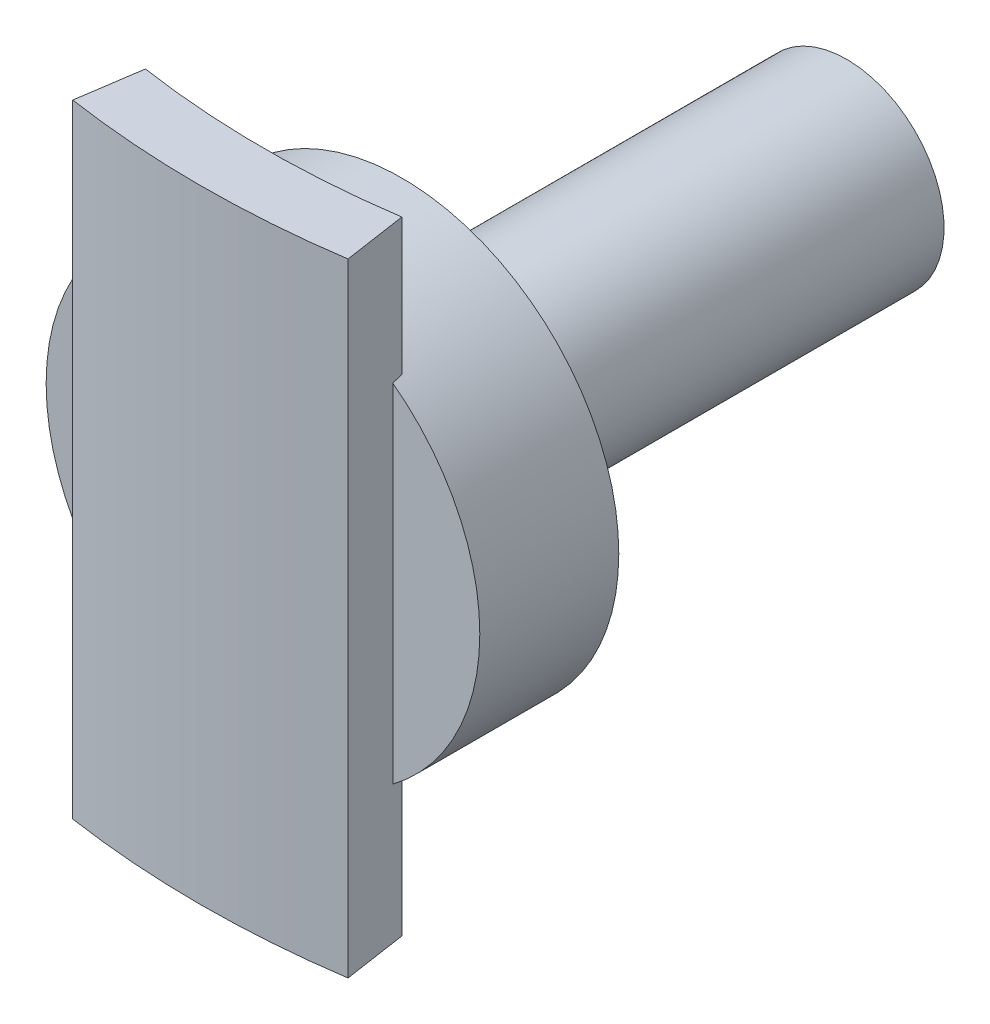
ISO-10303-21;
HEADER;
FILE_DESCRIPTION(('STEP AP214'),'2;1');
FILE_NAME('part.step','',(''),(''),'','','');
FILE_SCHEMA(('AUTOMOTIVE_DESIGN { 1 0 10303 214 1 1 1 1 }'));
ENDSEC;
DATA;
#1=APPLICATION_CONTEXT('core data for automotive mechanical design processes');
#2=APPLICATION_PROTOCOL_DEFINITION('international standard','automotive_design',2000,#1);
#3=PRODUCT_CONTEXT('',#1,'mechanical');
#4=PRODUCT('Part','Part','',(#3));
#5=PRODUCT_RELATED_PRODUCT_CATEGORY('part','',(#4));
#6=PRODUCT_DEFINITION_FORMATION('','',#4);
#7=PRODUCT_DEFINITION_CONTEXT('part definition',#1,'design');
#8=PRODUCT_DEFINITION('design','',#6,#7);
#9=PRODUCT_DEFINITION_SHAPE('','',#8);
#10=(LENGTH_UNIT() NAMED_UNIT(*) SI_UNIT(.MILLI.,.METRE.));
#11=(NAMED_UNIT(*) PLANE_ANGLE_UNIT() SI_UNIT($,.RADIAN.));
#12=(NAMED_UNIT(*) SI_UNIT($,.STERADIAN.) SOLID_ANGLE_UNIT());
#13=UNCERTAINTY_MEASURE_WITH_UNIT(LENGTH_MEASURE(1.E-05),#10,'distance_accuracy_value','');
#14=(GEOMETRIC_REPRESENTATION_CONTEXT(3) GLOBAL_UNCERTAINTY_ASSIGNED_CONTEXT((#13)) GLOBAL_UNIT_ASSIGNED_CONTEXT((#10,
#11,#12)) REPRESENTATION_CONTEXT('',''));
#15=CARTESIAN_POINT('',(0.,0.,0.));
#16=DIRECTION('',(0.,0.,1.));
#17=DIRECTION('',(1.,0.,0.));
#18=AXIS2_PLACEMENT_3D('',#15,#16,#17);
#19=CARTESIAN_POINT('',(0.,20.2,0.));
#20=DIRECTION('',(0.,-1.,0.));
#21=DIRECTION('',(0.,0.,-1.));
#22=AXIS2_PLACEMENT_3D('',#19,#20,#21);
#23=CYLINDRICAL_SURFACE('',#22,15.6);
#24=DIRECTION('',(0.,1.,0.));
#25=VECTOR('',#24,1.);
#26=CARTESIAN_POINT('',(-2.30582681362193,0.,15.4286474684459));
#27=LINE('',#26,#25);
#28=CARTESIAN_POINT('',(-2.30582681362193,22.1,15.4286474684459));
#29=VERTEX_POINT('',#28);
#30=CARTESIAN_POINT('',(-2.30582681362193,24.5546601605578,15.4286474684459));
#31=VERTEX_POINT('',#30);
#32=EDGE_CURVE('E153',#29,#31,#27,.T.);
#33=ORIENTED_EDGE('',*,*,#32,.T.);
#34=CARTESIAN_POINT('',(-3.9,27.7,15.1046350502089));
#35=CARTESIAN_POINT('',(-3.89999388260519,27.4846408285545,15.1046391613706));
#36=CARTESIAN_POINT('',(-3.88210094297634,27.2692139580615,15.1092911738277));
#37=CARTESIAN_POINT('',(-3.81111607572352,26.8445465780493,15.127349047084));
#38=CARTESIAN_POINT('',(-3.75800366251768,26.6353097430296,15.1407600024974));
#39=CARTESIAN_POINT('',(-3.61840627142598,26.229226480428,15.1747241036999));
#40=CARTESIAN_POINT('',(-3.53196437545301,26.0323644375983,15.1952680259711));
#41=CARTESIAN_POINT('',(-3.32829298036776,25.6559150700378,15.2411717956486));
#42=CARTESIAN_POINT('',(-3.21106217415467,25.4763284791549,15.2665318475044));
#43=CARTESIAN_POINT('',(-2.94638514660653,25.1355758333909,15.3198351751477));
#44=CARTESIAN_POINT('',(-2.79838554481832,24.9748459834539,15.3478197229193));
#45=CARTESIAN_POINT('',(-2.47756401999703,24.6802122247979,15.4028608580386));
#46=CARTESIAN_POINT('',(-2.30473977892128,24.5463108240301,15.4299173584357));
#47=CARTESIAN_POINT('',(-1.93618651368317,24.3073502704952,15.4805104821211));
#48=CARTESIAN_POINT('',(-1.74017153886439,24.2027196344681,15.5039927234492));
#49=CARTESIAN_POINT('',(-1.33265056749671,24.0280569551212,15.5443206660453));
#50=CARTESIAN_POINT('',(-1.12114686183543,23.9580198070118,15.5611673464158));
#51=CARTESIAN_POINT('',(-0.693199663656491,23.8559293780574,15.5860342380316));
#52=CARTESIAN_POINT('',(-0.476943042496402,23.8231353548505,15.5942263439713));
#53=CARTESIAN_POINT('',(-0.0418529580499183,23.7941369283301,15.6014600680739));
#54=CARTESIAN_POINT('',(0.176980119479392,23.797927115353,15.6005030391087));
#55=CARTESIAN_POINT('',(0.605873763972307,23.8414567663902,15.589674281275));
#56=CARTESIAN_POINT('',(0.816021240844146,23.880396667084,15.5800008365172));
#57=CARTESIAN_POINT('',(1.22669916491339,23.9918351812757,15.5530570497882));
#58=CARTESIAN_POINT('',(1.42722909954476,24.0643355811889,15.5357863034174));
#59=CARTESIAN_POINT('',(1.81508614365699,24.2414840102717,15.4952851513322));
#60=CARTESIAN_POINT('',(2.00227758808916,24.3464165896719,15.4720023072363));
#61=CARTESIAN_POINT('',(2.35667492712812,24.5852348594218,15.422002499437));
#62=CARTESIAN_POINT('',(2.52387733683426,24.7191255869562,15.3952849386031));
#63=CARTESIAN_POINT('',(2.83831873683052,25.0163456374908,15.3404739347796));
#64=CARTESIAN_POINT('',(2.98489494839022,25.1803736320562,15.3123628245103));
#65=CARTESIAN_POINT('',(3.24860786625883,25.5309759587292,15.2585946789546));
#66=CARTESIAN_POINT('',(3.36574319659088,25.7175513440298,15.2329377584043));
#67=CARTESIAN_POINT('',(3.56767370317946,26.1092524532539,15.1869197502202));
#68=CARTESIAN_POINT('',(3.65230931114669,26.3144637392104,15.1665849448002));
#69=CARTESIAN_POINT('',(3.78567392044301,26.7368333301191,15.1338507851364));
#70=CARTESIAN_POINT('',(3.83441060554653,26.9539890677913,15.1214497328337));
#71=CARTESIAN_POINT('',(3.89349423632805,27.3879368224039,15.1063435540213));
#72=CARTESIAN_POINT('',(3.9048211393163,27.6045869576166,15.1033909881218));
#73=CARTESIAN_POINT('',(3.89144650520118,28.0366822210684,15.1068425564075));
#74=CARTESIAN_POINT('',(3.86674828464504,28.2521274583999,15.113245829275));
#75=CARTESIAN_POINT('',(3.78288372374432,28.672058253321,15.134450478987));
#76=CARTESIAN_POINT('',(3.72428794651994,28.8766654534483,15.1491127357892));
#77=CARTESIAN_POINT('',(3.57492420740575,29.2731530742509,15.185051204894));
#78=CARTESIAN_POINT('',(3.48415243443146,29.4650319841269,15.2063282006424));
#79=CARTESIAN_POINT('',(3.27096224198114,29.8347683934725,15.2536197386916));
#80=CARTESIAN_POINT('',(3.14795793598361,30.0122769904671,15.2797190302734));
#81=CARTESIAN_POINT('',(2.87453514244435,30.3444938459703,15.3335064959089));
#82=CARTESIAN_POINT('',(2.72411214974121,30.4991983499742,15.3611949305615));
#83=CARTESIAN_POINT('',(2.39562461184044,30.7853852264107,15.4158794872958));
#84=CARTESIAN_POINT('',(2.21696261487321,30.9161896975761,15.4428409521654));
#85=CARTESIAN_POINT('',(1.83964046250923,31.1459399524439,15.4923165791735));
#86=CARTESIAN_POINT('',(1.64098135093461,31.2448873979088,15.5148309732616));
#87=CARTESIAN_POINT('',(1.23067698675125,31.4072558138636,15.5527338055179));
#88=CARTESIAN_POINT('',(1.01913778600874,31.4709322836313,15.5681733483496));
#89=CARTESIAN_POINT('',(0.587924065243346,31.5617181219891,15.5904105769743));
#90=CARTESIAN_POINT('',(0.368251123660837,31.5888345476329,15.5972099305374));
#91=CARTESIAN_POINT('',(-0.0666257531289618,31.6053335993446,15.6013326069434));
#92=CARTESIAN_POINT('',(-0.281789925167486,31.5957166654721,15.5989071763196));
#93=CARTESIAN_POINT('',(-0.707333236017529,31.541313473552,15.5854099618403));
#94=CARTESIAN_POINT('',(-0.917712516945622,31.4965282614486,15.5743384351296));
#95=CARTESIAN_POINT('',(-1.32666703901462,31.3735963428936,15.5448318813017));
#96=CARTESIAN_POINT('',(-1.52529972886537,31.2956305320739,15.5264368155933));
#97=CARTESIAN_POINT('',(-1.90677650686234,31.1087147418237,15.4842202676327));
#98=CARTESIAN_POINT('',(-2.08961860093597,30.9997608565851,15.4603981014115));
#99=CARTESIAN_POINT('',(-2.43906752085088,30.7509105874151,15.4091827375312));
#100=CARTESIAN_POINT('',(-2.60518045436351,30.6103354426751,15.3817176607249));
#101=CARTESIAN_POINT('',(-2.91179857906667,30.3035508772883,15.3266353132304));
#102=CARTESIAN_POINT('',(-3.0522972677987,30.1373349671665,15.2990180057248));
#103=CARTESIAN_POINT('',(-3.30627190324014,29.7802544846611,15.2461715579746));
#104=CARTESIAN_POINT('',(-3.41919481572388,29.5889879188755,15.2209965832583));
#105=CARTESIAN_POINT('',(-3.61111489668333,29.1895835894882,15.1766142642983));
#106=CARTESIAN_POINT('',(-3.69013674803339,28.981458232234,15.1574025810953));
#107=CARTESIAN_POINT('',(-3.80024786142691,28.5947496538429,15.1301244412788));
#108=CARTESIAN_POINT('',(-3.83757336532783,28.4180166588941,15.1206378571365));
#109=CARTESIAN_POINT('',(-3.8874509410299,28.060871410909,15.1078917047222));
#110=CARTESIAN_POINT('',(-3.90000512604983,27.8804594730468,15.1046316052752));
#111=CARTESIAN_POINT('',(-3.9,27.7,15.1046350502089));
#112=B_SPLINE_CURVE_WITH_KNOTS('',3,(#34,#35,#36,#37,#38,#39,#40,#41,#42,#43,#44,#45,#46,#47,
#48,#49,#50,#51,#52,#53,#54,#55,#56,#57,#58,#59,#60,#61,#62,#63,#64,#65,#66,#67,#68,#69,#70,#71,
#72,#73,#74,#75,#76,#77,#78,#79,#80,#81,#82,#83,#84,#85,#86,#87,#88,#89,#90,#91,#92,#93,#94,#95,
#96,#97,#98,#99,#100,#101,#102,#103,#104,#105,#106,#107,#108,#109,#110,#111),.UNSPECIFIED.,.T.,
.F.,(4,2,2,2,2,2,2,2,2,2,2,2,2,2,2,2,2,2,2,2,2,2,2,2,2,2,2,2,2,2,2,2,2,2,2,2,2,2,4),(0.,
0.645414809108371,1.29120535662872,1.93616393437899,2.58114989738546,3.23893368541043,
3.89677893508592,4.56380334380755,5.23072929361464,5.88414451552741,6.53746311918992,
7.17628489794757,7.81514068490666,8.45976883836934,9.10450921331505,9.76669927852182,
10.4289202867169,11.0943523393495,11.7596419220605,12.4073597663612,13.055017984184,
13.6920795182603,14.3292165342908,14.9788523955196,15.6285950947234,16.2945951631757,
16.9605604853417,17.6216363359048,18.2825845630977,18.925661759705,19.5687198311976,
20.2083160744482,20.8479929696306,21.502994706797,22.1581624925387,22.8255530457812,
23.4924568534898,24.0333261041369,24.5741492117231),.UNSPECIFIED.);
#113=CARTESIAN_POINT('',(2.30582681362193,24.5546601605578,15.4286474684459));
#114=VERTEX_POINT('',#113);
#115=EDGE_CURVE('E51',#31,#114,#112,.T.);
#116=ORIENTED_EDGE('',*,*,#115,.T.);
#117=DIRECTION('',(0.,1.,0.));
#118=VECTOR('',#117,1.);
#119=CARTESIAN_POINT('',(2.30582681362193,0.,15.4286474684459));
#120=LINE('',#119,#118);
#121=CARTESIAN_POINT('',(2.30582681362193,22.1,15.4286474684459));
#122=VERTEX_POINT('',#121);
#123=EDGE_CURVE('E141',#122,#114,#120,.T.);
#124=ORIENTED_EDGE('',*,*,#123,.F.);
#125=CARTESIAN_POINT('',(0.,22.1,0.));
#126=DIRECTION('',(0.,-1.,0.));
#127=DIRECTION('',(0.,0.,-1.));
#128=AXIS2_PLACEMENT_3D('',#125,#126,#127);
#129=CIRCLE('',#128,15.6);
#130=EDGE_CURVE('E127',#122,#29,#129,.T.);
#131=ORIENTED_EDGE('',*,*,#130,.T.);
#132=EDGE_LOOP('',(#33,#116,#124,#131));
#133=FACE_BOUND('',#132,.T.);
#134=ADVANCED_FACE('F36',(#133),#23,.F.);
#135=CARTESIAN_POINT('',(0.,20.2,0.));
#136=DIRECTION('',(0.,-1.,0.));
#137=DIRECTION('',(0.,0.,-1.));
#138=AXIS2_PLACEMENT_3D('',#135,#136,#137);
#139=CYLINDRICAL_SURFACE('',#138,16.75);
#140=CARTESIAN_POINT('',(0.,22.1,0.));
#141=DIRECTION('',(0.,-1.,0.));
#142=DIRECTION('',(0.,0.,-1.));
#143=AXIS2_PLACEMENT_3D('',#140,#141,#142);
#144=CIRCLE('',#143,16.75);
#145=CARTESIAN_POINT('',(2.47580763642098,22.1,16.5660157113121));
#146=VERTEX_POINT('',#145);
#147=CARTESIAN_POINT('',(-2.47580763642098,22.1,16.5660157113121));
#148=VERTEX_POINT('',#147);
#149=EDGE_CURVE('E124',#146,#148,#144,.T.);
#150=ORIENTED_EDGE('',*,*,#149,.F.);
#151=DIRECTION('',(0.,-1.,0.));
#152=VECTOR('',#151,1.);
#153=CARTESIAN_POINT('',(2.47580763642098,0.,16.5660157113121));
#154=LINE('',#153,#152);
#155=CARTESIAN_POINT('',(2.47580763642098,33.3,16.5660157113121));
#156=VERTEX_POINT('',#155);
#157=EDGE_CURVE('E148',#156,#146,#154,.T.);
#158=ORIENTED_EDGE('',*,*,#157,.F.);
#159=CARTESIAN_POINT('',(0.,33.3,0.));
#160=DIRECTION('',(0.,-1.,0.));
#161=DIRECTION('',(0.,0.,-1.));
#162=AXIS2_PLACEMENT_3D('',#159,#160,#161);
#163=CIRCLE('',#162,16.75);
#164=CARTESIAN_POINT('',(-2.47580763642098,33.3,16.5660157113121));
#165=VERTEX_POINT('',#164);
#166=EDGE_CURVE('E59',#156,#165,#163,.T.);
#167=ORIENTED_EDGE('',*,*,#166,.T.);
#168=DIRECTION('',(0.,-1.,0.));
#169=VECTOR('',#168,1.);
#170=CARTESIAN_POINT('',(-2.47580763642098,0.,16.5660157113121));
#171=LINE('',#170,#169);
#172=EDGE_CURVE('E157',#165,#148,#171,.T.);
#173=ORIENTED_EDGE('',*,*,#172,.T.);
#174=EDGE_LOOP('',(#150,#158,#167,#173));
#175=FACE_BOUND('',#174,.T.);
#176=ADVANCED_FACE('F191',(#175),#139,.T.);
#177=CARTESIAN_POINT('',(0.,22.1,0.));
#178=DIRECTION('',(0.,1.,0.));
#179=DIRECTION('',(0.,0.,1.));
#180=AXIS2_PLACEMENT_3D('',#177,#178,#179);
#181=PLANE('',#180);
#182=ORIENTED_EDGE('',*,*,#130,.F.);
#183=DIRECTION('',(-0.147809411129611,0.,-0.989015863361917));
#184=VECTOR('',#183,1.);
#185=CARTESIAN_POINT('',(0.,22.1,0.));
#186=LINE('',#185,#184);
#187=EDGE_CURVE('E145',#146,#122,#186,.T.);
#188=ORIENTED_EDGE('',*,*,#187,.F.);
#189=ORIENTED_EDGE('',*,*,#149,.T.);
#190=DIRECTION('',(0.147809411129611,0.,-0.989015863361917));
#191=VECTOR('',#190,1.);
#192=CARTESIAN_POINT('',(0.,22.1,0.));
#193=LINE('',#192,#191);
#194=EDGE_CURVE('E155',#148,#29,#193,.T.);
#195=ORIENTED_EDGE('',*,*,#194,.T.);
#196=EDGE_LOOP('',(#182,#188,#189,#195));
#197=FACE_BOUND('',#196,.T.);
#198=ADVANCED_FACE('F193',(#197),#181,.F.);
#199=CARTESIAN_POINT('',(2.30582681362193,30.8453398394422,15.4286474684459));
#200=VERTEX_POINT('',#199);
#201=CARTESIAN_POINT('',(2.30582681362193,33.3,15.4286474684459));
#202=VERTEX_POINT('',#201);
#203=EDGE_CURVE('E144',#200,#202,#120,.T.);
#204=ORIENTED_EDGE('',*,*,#203,.F.);
#205=CARTESIAN_POINT('',(-2.30582681362193,30.8453398394422,15.4286474684459));
#206=VERTEX_POINT('',#205);
#207=EDGE_CURVE('E164',#200,#206,#112,.T.);
#208=ORIENTED_EDGE('',*,*,#207,.T.);
#209=CARTESIAN_POINT('',(-2.30582681362193,33.3,15.4286474684459));
#210=VERTEX_POINT('',#209);
#211=EDGE_CURVE('E120',#206,#210,#27,.T.);
#212=ORIENTED_EDGE('',*,*,#211,.T.);
#213=CARTESIAN_POINT('',(0.,33.3,0.));
#214=DIRECTION('',(0.,-1.,0.));
#215=DIRECTION('',(0.,0.,-1.));
#216=AXIS2_PLACEMENT_3D('',#213,#214,#215);
#217=CIRCLE('',#216,15.6);
#218=EDGE_CURVE('E132',#202,#210,#217,.T.);
#219=ORIENTED_EDGE('',*,*,#218,.F.);
#220=EDGE_LOOP('',(#204,#208,#212,#219));
#221=FACE_BOUND('',#220,.T.);
#222=ADVANCED_FACE('F171',(#221),#23,.F.);
#223=CARTESIAN_POINT('',(0.,33.3,0.));
#224=DIRECTION('',(0.,-1.,0.));
#225=DIRECTION('',(0.,0.,-1.));
#226=AXIS2_PLACEMENT_3D('',#223,#224,#225);
#227=PLANE('',#226);
#228=DIRECTION('',(0.147809411129611,0.,0.989015863361917));
#229=VECTOR('',#228,1.);
#230=CARTESIAN_POINT('',(0.,33.3,0.));
#231=LINE('',#230,#229);
#232=EDGE_CURVE('E138',#202,#156,#231,.T.);
#233=ORIENTED_EDGE('',*,*,#232,.F.);
#234=ORIENTED_EDGE('',*,*,#218,.T.);
#235=DIRECTION('',(-0.147809411129611,0.,0.989015863361917));
#236=VECTOR('',#235,1.);
#237=CARTESIAN_POINT('',(0.,33.3,0.));
#238=LINE('',#237,#236);
#239=EDGE_CURVE('E151',#210,#165,#238,.T.);
#240=ORIENTED_EDGE('',*,*,#239,.T.);
#241=ORIENTED_EDGE('',*,*,#166,.F.);
#242=EDGE_LOOP('',(#233,#234,#240,#241));
#243=FACE_BOUND('',#242,.T.);
#244=ADVANCED_FACE('F189',(#243),#227,.F.);
#245=CARTESIAN_POINT('',(0.,0.,0.));
#246=DIRECTION('',(0.989015863361917,0.,-0.147809411129611));
#247=DIRECTION('',(-0.147809411129611,0.,-0.989015863361917));
#248=AXIS2_PLACEMENT_3D('',#245,#246,#247);
#249=PLANE('',#248);
#250=CARTESIAN_POINT('',(0.,27.7,0.));
#251=DIRECTION('',(0.989015863361917,0.,-0.147809411129611));
#252=DIRECTION('',(-0.147809411129611,0.,-0.989015863361917));
#253=AXIS2_PLACEMENT_3D('',#250,#251,#252);
#254=ELLIPSE('',#253,26.3853293927284,3.9);
#255=CARTESIAN_POINT('',(2.33443772357328,30.82416397053,15.6200875370508));
#256=VERTEX_POINT('',#255);
#257=EDGE_CURVE('E161',#200,#256,#254,.T.);
#258=ORIENTED_EDGE('',*,*,#257,.F.);
#259=ORIENTED_EDGE('',*,*,#203,.T.);
#260=ORIENTED_EDGE('',*,*,#232,.T.);
#261=ORIENTED_EDGE('',*,*,#157,.T.);
#262=ORIENTED_EDGE('',*,*,#187,.T.);
#263=ORIENTED_EDGE('',*,*,#123,.T.);
#264=CARTESIAN_POINT('',(2.33443772357328,24.57583602947,15.6200875370508));
#265=VERTEX_POINT('',#264);
#266=EDGE_CURVE('E162',#265,#114,#254,.T.);
#267=ORIENTED_EDGE('',*,*,#266,.F.);
#268=DIRECTION('',(0.,-1.,0.));
#269=VECTOR('',#268,1.);
#270=CARTESIAN_POINT('',(2.33443772357328,0.,15.6200875370508));
#271=LINE('',#270,#269);
#272=EDGE_CURVE('E159',#256,#265,#271,.T.);
#273=ORIENTED_EDGE('',*,*,#272,.F.);
#274=EDGE_LOOP('',(#258,#259,#260,#261,#262,#263,#267,#273));
#275=FACE_BOUND('',#274,.T.);
#276=ADVANCED_FACE('F186',(#275),#249,.T.);
#277=CARTESIAN_POINT('',(0.,0.,0.));
#278=DIRECTION('',(0.989015863361917,0.,0.147809411129611));
#279=DIRECTION('',(0.147809411129611,0.,-0.989015863361917));
#280=AXIS2_PLACEMENT_3D('',#277,#278,#279);
#281=PLANE('',#280);
#282=ORIENTED_EDGE('',*,*,#211,.F.);
#283=CARTESIAN_POINT('',(0.,27.7,0.));
#284=DIRECTION('',(0.989015863361917,0.,0.147809411129611));
#285=DIRECTION('',(0.147809411129611,0.,-0.989015863361917));
#286=AXIS2_PLACEMENT_3D('',#283,#284,#285);
#287=ELLIPSE('',#286,26.3853293927284,3.9);
#288=CARTESIAN_POINT('',(-2.33443772357328,30.82416397053,15.6200875370508));
#289=VERTEX_POINT('',#288);
#290=EDGE_CURVE('E108',#206,#289,#287,.T.);
#291=ORIENTED_EDGE('',*,*,#290,.T.);
#292=DIRECTION('',(0.,-1.,0.));
#293=VECTOR('',#292,1.);
#294=CARTESIAN_POINT('',(-2.33443772357328,0.,15.6200875370508));
#295=LINE('',#294,#293);
#296=CARTESIAN_POINT('',(-2.33443772357328,24.57583602947,15.6200875370508));
#297=VERTEX_POINT('',#296);
#298=EDGE_CURVE('E102',#289,#297,#295,.T.);
#299=ORIENTED_EDGE('',*,*,#298,.T.);
#300=EDGE_CURVE('E109',#297,#31,#287,.T.);
#301=ORIENTED_EDGE('',*,*,#300,.T.);
#302=ORIENTED_EDGE('',*,*,#32,.F.);
#303=ORIENTED_EDGE('',*,*,#194,.F.);
#304=ORIENTED_EDGE('',*,*,#172,.F.);
#305=ORIENTED_EDGE('',*,*,#239,.F.);
#306=EDGE_LOOP('',(#282,#291,#299,#301,#302,#303,#304,#305));
#307=FACE_BOUND('',#306,.T.);
#308=ADVANCED_FACE('F118',(#307),#281,.F.);
#309=CARTESIAN_POINT('',(0.,27.7,15.6200875370508));
#310=DIRECTION('',(0.,0.,1.));
#311=DIRECTION('',(1.,0.,0.));
#312=AXIS2_PLACEMENT_3D('',#309,#310,#311);
#313=PLANE('',#312);
#314=ORIENTED_EDGE('',*,*,#298,.F.);
#315=CARTESIAN_POINT('',(0.,27.7,15.6200875370508));
#316=DIRECTION('',(0.,0.,-1.));
#317=DIRECTION('',(-1.,0.,0.));
#318=AXIS2_PLACEMENT_3D('',#315,#316,#317);
#319=CIRCLE('',#318,3.9);
#320=EDGE_CURVE('E105',#297,#289,#319,.T.);
#321=ORIENTED_EDGE('',*,*,#320,.F.);
#322=EDGE_LOOP('',(#314,#321));
#323=FACE_BOUND('',#322,.T.);
#324=ADVANCED_FACE('F104',(#323),#313,.T.);
#325=EDGE_CURVE('E114',#256,#265,#319,.T.);
#326=ORIENTED_EDGE('',*,*,#325,.F.);
#327=ORIENTED_EDGE('',*,*,#272,.T.);
#328=EDGE_LOOP('',(#326,#327));
#329=FACE_BOUND('',#328,.T.);
#330=ADVANCED_FACE('F179',(#329),#313,.T.);
#331=CARTESIAN_POINT('',(0.,27.7,13.1200875370508));
#332=DIRECTION('',(0.,0.,-1.));
#333=DIRECTION('',(-1.,0.,0.));
#334=AXIS2_PLACEMENT_3D('',#331,#332,#333);
#335=CYLINDRICAL_SURFACE('',#334,3.9);
#336=ORIENTED_EDGE('',*,*,#207,.F.);
#337=ORIENTED_EDGE('',*,*,#257,.T.);
#338=ORIENTED_EDGE('',*,*,#325,.T.);
#339=ORIENTED_EDGE('',*,*,#266,.T.);
#340=ORIENTED_EDGE('',*,*,#115,.F.);
#341=ORIENTED_EDGE('',*,*,#300,.F.);
#342=ORIENTED_EDGE('',*,*,#320,.T.);
#343=ORIENTED_EDGE('',*,*,#290,.F.);
#344=EDGE_LOOP('',(#336,#337,#338,#339,#340,#341,#342,#343));
#345=FACE_BOUND('',#344,.T.);
#346=CARTESIAN_POINT('',(0.,27.7,13.1200875370508));
#347=DIRECTION('',(0.,0.,-1.));
#348=DIRECTION('',(-1.,0.,0.));
#349=AXIS2_PLACEMENT_3D('',#346,#347,#348);
#350=CIRCLE('',#349,3.9);
#351=CARTESIAN_POINT('',(-3.9,27.7,13.1200875370508));
#352=VERTEX_POINT('',#351);
#353=EDGE_CURVE('E115',#352,#352,#350,.T.);
#354=ORIENTED_EDGE('',*,*,#353,.F.);
#355=EDGE_LOOP('',(#354));
#356=FACE_BOUND('',#355,.T.);
#357=ADVANCED_FACE('F111',(#345,#356),#335,.T.);
#358=CARTESIAN_POINT('',(0.,31.6,13.1200875370508));
#359=DIRECTION('',(0.,0.,-1.));
#360=DIRECTION('',(-1.,0.,0.));
#361=AXIS2_PLACEMENT_3D('',#358,#359,#360);
#362=PLANE('',#361);
#363=CARTESIAN_POINT('',(0.,27.7,13.1200875370508));
#364=DIRECTION('',(0.,0.,-1.));
#365=DIRECTION('',(-1.,0.,0.));
#366=AXIS2_PLACEMENT_3D('',#363,#364,#365);
#367=CIRCLE('',#366,2.75);
#368=CARTESIAN_POINT('',(-2.75,27.7,13.1200875370508));
#369=VERTEX_POINT('',#368);
#370=EDGE_CURVE('E11',#369,#369,#367,.F.);
#371=ORIENTED_EDGE('',*,*,#370,.T.);
#372=EDGE_LOOP('',(#371));
#373=FACE_BOUND('',#372,.T.);
#374=ORIENTED_EDGE('',*,*,#353,.T.);
#375=EDGE_LOOP('',(#374));
#376=FACE_BOUND('',#375,.T.);
#377=ADVANCED_FACE('F178',(#373,#376),#362,.T.);
#378=CARTESIAN_POINT('',(0.,27.7,5.12008753705083));
#379=DIRECTION('',(0.,0.,1.));
#380=DIRECTION('',(1.,0.,0.));
#381=AXIS2_PLACEMENT_3D('',#378,#379,#380);
#382=CYLINDRICAL_SURFACE('',#381,1.75);
#383=CARTESIAN_POINT('',(0.,27.7,12.1200875370508));
#384=DIRECTION('',(0.,0.,-1.));
#385=DIRECTION('',(-1.,0.,0.));
#386=AXIS2_PLACEMENT_3D('',#383,#384,#385);
#387=CIRCLE('',#386,1.75);
#388=CARTESIAN_POINT('',(-1.75,27.7,12.1200875370508));
#389=VERTEX_POINT('',#388);
#390=EDGE_CURVE('E44',#389,#389,#387,.T.);
#391=ORIENTED_EDGE('',*,*,#390,.T.);
#392=EDGE_LOOP('',(#391));
#393=FACE_BOUND('',#392,.T.);
#394=CARTESIAN_POINT('',(0.,27.7,5.12008753705083));
#395=DIRECTION('',(0.,0.,-1.));
#396=DIRECTION('',(-1.,0.,0.));
#397=AXIS2_PLACEMENT_3D('',#394,#395,#396);
#398=CIRCLE('',#397,1.75);
#399=CARTESIAN_POINT('',(-1.75,27.7,5.12008753705083));
#400=VERTEX_POINT('',#399);
#401=EDGE_CURVE('E306',#400,#400,#398,.T.);
#402=ORIENTED_EDGE('',*,*,#401,.F.);
#403=EDGE_LOOP('',(#402));
#404=FACE_BOUND('',#403,.T.);
#405=ADVANCED_FACE('F272',(#393,#404),#382,.T.);
#406=CARTESIAN_POINT('',(0.,27.7,5.12008753705083));
#407=DIRECTION('',(0.,0.,-1.));
#408=DIRECTION('',(-1.,0.,0.));
#409=AXIS2_PLACEMENT_3D('',#406,#407,#408);
#410=PLANE('',#409);
#411=ORIENTED_EDGE('',*,*,#401,.T.);
#412=EDGE_LOOP('',(#411));
#413=FACE_BOUND('',#412,.T.);
#414=ADVANCED_FACE('F282',(#413),#410,.T.);
#415=CARTESIAN_POINT('',(0.,27.7,12.1200875370508));
#416=DIRECTION('',(0.,0.,-1.));
#417=DIRECTION('',(-1.,0.,0.));
#418=AXIS2_PLACEMENT_3D('',#415,#416,#417);
#419=TOROIDAL_SURFACE('',#418,2.75,1.);
#420=ORIENTED_EDGE('',*,*,#370,.F.);
#421=EDGE_LOOP('',(#420));
#422=FACE_BOUND('',#421,.T.);
#423=ORIENTED_EDGE('',*,*,#390,.F.);
#424=EDGE_LOOP('',(#423));
#425=FACE_BOUND('',#424,.T.);
#426=ADVANCED_FACE('F38',(#422,#425),#419,.F.);
#427=CLOSED_SHELL('',(#134,#176,#198,#222,#244,#276,#308,#324,#330,#357,#377,#405,#414,#426));
#428=MANIFOLD_SOLID_BREP('B2',#427);
#429=ADVANCED_BREP_SHAPE_REPRESENTATION('',(#18,#428),#14);
#430=SHAPE_DEFINITION_REPRESENTATION(#9,#429);
ENDSEC;
END-ISO-10303-21;
